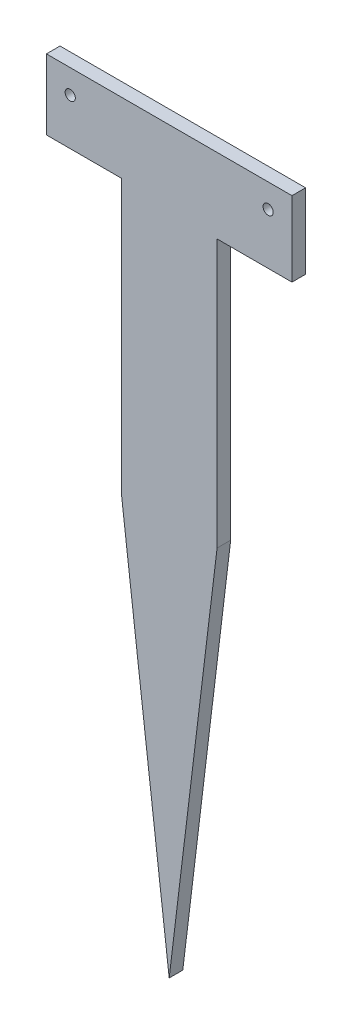
ISO-10303-21;
HEADER;
FILE_DESCRIPTION(('STEP AP214'),'2;1');
FILE_NAME('part.step','',(''),(''),'','','');
FILE_SCHEMA(('AUTOMOTIVE_DESIGN { 1 0 10303 214 1 1 1 1 }'));
ENDSEC;
DATA;
#1=APPLICATION_CONTEXT('core data for automotive mechanical design processes');
#2=APPLICATION_PROTOCOL_DEFINITION('international standard','automotive_design',2000,#1);
#3=PRODUCT_CONTEXT('',#1,'mechanical');
#4=PRODUCT('Part','Part','',(#3));
#5=PRODUCT_RELATED_PRODUCT_CATEGORY('part','',(#4));
#6=PRODUCT_DEFINITION_FORMATION('','',#4);
#7=PRODUCT_DEFINITION_CONTEXT('part definition',#1,'design');
#8=PRODUCT_DEFINITION('design','',#6,#7);
#9=PRODUCT_DEFINITION_SHAPE('','',#8);
#10=(LENGTH_UNIT() NAMED_UNIT(*) SI_UNIT(.MILLI.,.METRE.));
#11=(NAMED_UNIT(*) PLANE_ANGLE_UNIT() SI_UNIT($,.RADIAN.));
#12=(NAMED_UNIT(*) SI_UNIT($,.STERADIAN.) SOLID_ANGLE_UNIT());
#13=UNCERTAINTY_MEASURE_WITH_UNIT(LENGTH_MEASURE(1.E-05),#10,'distance_accuracy_value','');
#14=(GEOMETRIC_REPRESENTATION_CONTEXT(3) GLOBAL_UNCERTAINTY_ASSIGNED_CONTEXT((#13)) GLOBAL_UNIT_ASSIGNED_CONTEXT((#10,
#11,#12)) REPRESENTATION_CONTEXT('',''));
#15=CARTESIAN_POINT('',(0.,0.,0.));
#16=DIRECTION('',(0.,0.,1.));
#17=DIRECTION('',(1.,0.,0.));
#18=AXIS2_PLACEMENT_3D('',#15,#16,#17);
#19=CARTESIAN_POINT('',(0.,0.,4.));
#20=DIRECTION('',(0.,0.,-1.));
#21=DIRECTION('',(-1.,0.,0.));
#22=AXIS2_PLACEMENT_3D('',#19,#20,#21);
#23=PLANE('',#22);
#24=DIRECTION('',(0.,-1.,0.));
#25=VECTOR('',#24,1.);
#26=CARTESIAN_POINT('',(-7.,-13.6178388220856,4.));
#27=LINE('',#26,#25);
#28=CARTESIAN_POINT('',(-7.,7.,4.));
#29=VERTEX_POINT('',#28);
#30=CARTESIAN_POINT('',(-7.,-13.6178388220856,4.));
#31=VERTEX_POINT('',#30);
#32=EDGE_CURVE('E173',#29,#31,#27,.T.);
#33=ORIENTED_EDGE('',*,*,#32,.T.);
#34=DIRECTION('',(1.,0.,0.));
#35=VECTOR('',#34,1.);
#36=CARTESIAN_POINT('',(15.,-13.6178388220856,4.));
#37=LINE('',#36,#35);
#38=CARTESIAN_POINT('',(15.,-13.6178388220856,4.));
#39=VERTEX_POINT('',#38);
#40=EDGE_CURVE('E103',#31,#39,#37,.T.);
#41=ORIENTED_EDGE('',*,*,#40,.T.);
#42=DIRECTION('',(0.,-1.,0.));
#43=VECTOR('',#42,1.);
#44=CARTESIAN_POINT('',(15.,-93.6178388220856,4.));
#45=LINE('',#44,#43);
#46=CARTESIAN_POINT('',(15.,-93.6178388220856,4.));
#47=VERTEX_POINT('',#46);
#48=EDGE_CURVE('E198',#39,#47,#45,.T.);
#49=ORIENTED_EDGE('',*,*,#48,.T.);
#50=DIRECTION('',(0.119936836472726,-0.992781524433707,0.));
#51=VECTOR('',#50,1.);
#52=CARTESIAN_POINT('',(15.,-93.6178388220856,4.));
#53=LINE('',#52,#51);
#54=CARTESIAN_POINT('',(29.06,-210.,4.));
#55=VERTEX_POINT('',#54);
#56=EDGE_CURVE('E216',#47,#55,#53,.T.);
#57=ORIENTED_EDGE('',*,*,#56,.T.);
#58=DIRECTION('',(0.119936836472726,0.992781524433707,0.));
#59=VECTOR('',#58,1.);
#60=CARTESIAN_POINT('',(29.06,-210.,4.));
#61=LINE('',#60,#59);
#62=CARTESIAN_POINT('',(43.12,-93.6178388220856,4.));
#63=VERTEX_POINT('',#62);
#64=EDGE_CURVE('E214',#55,#63,#61,.T.);
#65=ORIENTED_EDGE('',*,*,#64,.T.);
#66=DIRECTION('',(0.,1.,0.));
#67=VECTOR('',#66,1.);
#68=CARTESIAN_POINT('',(43.12,-15.,4.));
#69=LINE('',#68,#67);
#70=CARTESIAN_POINT('',(43.12,-15.,4.));
#71=VERTEX_POINT('',#70);
#72=EDGE_CURVE('E125',#63,#71,#69,.T.);
#73=ORIENTED_EDGE('',*,*,#72,.T.);
#74=DIRECTION('',(1.,0.,0.));
#75=VECTOR('',#74,1.);
#76=CARTESIAN_POINT('',(65.12,-15.,4.));
#77=LINE('',#76,#75);
#78=CARTESIAN_POINT('',(65.12,-15.,4.));
#79=VERTEX_POINT('',#78);
#80=EDGE_CURVE('E119',#71,#79,#77,.T.);
#81=ORIENTED_EDGE('',*,*,#80,.T.);
#82=DIRECTION('',(0.,1.,0.));
#83=VECTOR('',#82,1.);
#84=CARTESIAN_POINT('',(65.12,7.,4.));
#85=LINE('',#84,#83);
#86=CARTESIAN_POINT('',(65.12,7.,4.));
#87=VERTEX_POINT('',#86);
#88=EDGE_CURVE('E123',#79,#87,#85,.T.);
#89=ORIENTED_EDGE('',*,*,#88,.T.);
#90=DIRECTION('',(-1.,0.,0.));
#91=VECTOR('',#90,1.);
#92=CARTESIAN_POINT('',(-7.,7.,4.));
#93=LINE('',#92,#91);
#94=EDGE_CURVE('E57',#87,#29,#93,.T.);
#95=ORIENTED_EDGE('',*,*,#94,.T.);
#96=EDGE_LOOP('',(#33,#41,#49,#57,#65,#73,#81,#89,#95));
#97=FACE_BOUND('',#96,.T.);
#98=CARTESIAN_POINT('',(0.,0.,4.));
#99=DIRECTION('',(0.,0.,1.));
#100=DIRECTION('',(1.,0.,0.));
#101=AXIS2_PLACEMENT_3D('',#98,#99,#100);
#102=CIRCLE('',#101,1.5);
#103=CARTESIAN_POINT('',(1.5,0.,4.));
#104=VERTEX_POINT('',#103);
#105=EDGE_CURVE('E152',#104,#104,#102,.T.);
#106=ORIENTED_EDGE('',*,*,#105,.F.);
#107=EDGE_LOOP('',(#106));
#108=FACE_BOUND('',#107,.T.);
#109=CARTESIAN_POINT('',(58.12,0.,4.));
#110=DIRECTION('',(0.,0.,1.));
#111=DIRECTION('',(1.,0.,0.));
#112=AXIS2_PLACEMENT_3D('',#109,#110,#111);
#113=CIRCLE('',#112,1.5);
#114=CARTESIAN_POINT('',(59.62,0.,4.));
#115=VERTEX_POINT('',#114);
#116=EDGE_CURVE('E232',#115,#115,#113,.T.);
#117=ORIENTED_EDGE('',*,*,#116,.F.);
#118=EDGE_LOOP('',(#117));
#119=FACE_BOUND('',#118,.T.);
#120=ADVANCED_FACE('F39',(#97,#108,#119),#23,.F.);
#121=CARTESIAN_POINT('',(0.,0.,0.));
#122=DIRECTION('',(0.,0.,-1.));
#123=DIRECTION('',(-1.,0.,0.));
#124=AXIS2_PLACEMENT_3D('',#121,#122,#123);
#125=PLANE('',#124);
#126=CARTESIAN_POINT('',(0.,0.,0.));
#127=DIRECTION('',(0.,0.,1.));
#128=DIRECTION('',(1.,0.,0.));
#129=AXIS2_PLACEMENT_3D('',#126,#127,#128);
#130=CIRCLE('',#129,1.5);
#131=CARTESIAN_POINT('',(1.5,0.,0.));
#132=VERTEX_POINT('',#131);
#133=EDGE_CURVE('E228',#132,#132,#130,.T.);
#134=ORIENTED_EDGE('',*,*,#133,.T.);
#135=EDGE_LOOP('',(#134));
#136=FACE_BOUND('',#135,.T.);
#137=DIRECTION('',(0.,-1.,0.));
#138=VECTOR('',#137,1.);
#139=CARTESIAN_POINT('',(-7.,-13.6178388220856,0.));
#140=LINE('',#139,#138);
#141=CARTESIAN_POINT('',(-7.,7.,0.));
#142=VERTEX_POINT('',#141);
#143=CARTESIAN_POINT('',(-7.,-13.6178388220856,0.));
#144=VERTEX_POINT('',#143);
#145=EDGE_CURVE('E147',#142,#144,#140,.T.);
#146=ORIENTED_EDGE('',*,*,#145,.F.);
#147=DIRECTION('',(-1.,0.,0.));
#148=VECTOR('',#147,1.);
#149=CARTESIAN_POINT('',(-7.,7.,0.));
#150=LINE('',#149,#148);
#151=CARTESIAN_POINT('',(65.12,7.,0.));
#152=VERTEX_POINT('',#151);
#153=EDGE_CURVE('E95',#152,#142,#150,.T.);
#154=ORIENTED_EDGE('',*,*,#153,.F.);
#155=DIRECTION('',(0.,1.,0.));
#156=VECTOR('',#155,1.);
#157=CARTESIAN_POINT('',(65.12,7.,0.));
#158=LINE('',#157,#156);
#159=CARTESIAN_POINT('',(65.12,-15.,0.));
#160=VERTEX_POINT('',#159);
#161=EDGE_CURVE('E89',#160,#152,#158,.T.);
#162=ORIENTED_EDGE('',*,*,#161,.F.);
#163=DIRECTION('',(1.,0.,0.));
#164=VECTOR('',#163,1.);
#165=CARTESIAN_POINT('',(65.12,-15.,0.));
#166=LINE('',#165,#164);
#167=CARTESIAN_POINT('',(43.12,-15.,0.));
#168=VERTEX_POINT('',#167);
#169=EDGE_CURVE('E134',#168,#160,#166,.T.);
#170=ORIENTED_EDGE('',*,*,#169,.F.);
#171=DIRECTION('',(0.,1.,0.));
#172=VECTOR('',#171,1.);
#173=CARTESIAN_POINT('',(43.12,-15.,0.));
#174=LINE('',#173,#172);
#175=CARTESIAN_POINT('',(43.12,-93.6178388220856,0.));
#176=VERTEX_POINT('',#175);
#177=EDGE_CURVE('E164',#176,#168,#174,.T.);
#178=ORIENTED_EDGE('',*,*,#177,.F.);
#179=DIRECTION('',(0.119936836472726,0.992781524433707,0.));
#180=VECTOR('',#179,1.);
#181=CARTESIAN_POINT('',(29.06,-210.,0.));
#182=LINE('',#181,#180);
#183=CARTESIAN_POINT('',(29.06,-210.,0.));
#184=VERTEX_POINT('',#183);
#185=EDGE_CURVE('E161',#184,#176,#182,.T.);
#186=ORIENTED_EDGE('',*,*,#185,.F.);
#187=DIRECTION('',(0.119936836472726,-0.992781524433707,0.));
#188=VECTOR('',#187,1.);
#189=CARTESIAN_POINT('',(15.,-93.6178388220856,0.));
#190=LINE('',#189,#188);
#191=CARTESIAN_POINT('',(15.,-93.6178388220856,0.));
#192=VERTEX_POINT('',#191);
#193=EDGE_CURVE('E158',#192,#184,#190,.T.);
#194=ORIENTED_EDGE('',*,*,#193,.F.);
#195=DIRECTION('',(0.,-1.,0.));
#196=VECTOR('',#195,1.);
#197=CARTESIAN_POINT('',(15.,-93.6178388220856,0.));
#198=LINE('',#197,#196);
#199=CARTESIAN_POINT('',(15.,-13.6178388220856,0.));
#200=VERTEX_POINT('',#199);
#201=EDGE_CURVE('E155',#200,#192,#198,.T.);
#202=ORIENTED_EDGE('',*,*,#201,.F.);
#203=DIRECTION('',(1.,0.,0.));
#204=VECTOR('',#203,1.);
#205=CARTESIAN_POINT('',(15.,-13.6178388220856,0.));
#206=LINE('',#205,#204);
#207=EDGE_CURVE('E151',#144,#200,#206,.T.);
#208=ORIENTED_EDGE('',*,*,#207,.F.);
#209=EDGE_LOOP('',(#146,#154,#162,#170,#178,#186,#194,#202,#208));
#210=FACE_BOUND('',#209,.T.);
#211=CARTESIAN_POINT('',(58.12,0.,0.));
#212=DIRECTION('',(0.,0.,1.));
#213=DIRECTION('',(1.,0.,0.));
#214=AXIS2_PLACEMENT_3D('',#211,#212,#213);
#215=CIRCLE('',#214,1.5);
#216=CARTESIAN_POINT('',(59.62,0.,0.));
#217=VERTEX_POINT('',#216);
#218=EDGE_CURVE('E236',#217,#217,#215,.T.);
#219=ORIENTED_EDGE('',*,*,#218,.T.);
#220=EDGE_LOOP('',(#219));
#221=FACE_BOUND('',#220,.T.);
#222=ADVANCED_FACE('F202',(#136,#210,#221),#125,.T.);
#223=CARTESIAN_POINT('',(-7.,-13.6178388220856,4.));
#224=DIRECTION('',(1.,0.,0.));
#225=DIRECTION('',(0.,0.,-1.));
#226=AXIS2_PLACEMENT_3D('',#223,#224,#225);
#227=PLANE('',#226);
#228=ORIENTED_EDGE('',*,*,#145,.T.);
#229=DIRECTION('',(0.,0.,-1.));
#230=VECTOR('',#229,1.);
#231=CARTESIAN_POINT('',(-7.,-13.6178388220856,4.));
#232=LINE('',#231,#230);
#233=EDGE_CURVE('E11',#31,#144,#232,.T.);
#234=ORIENTED_EDGE('',*,*,#233,.F.);
#235=ORIENTED_EDGE('',*,*,#32,.F.);
#236=DIRECTION('',(0.,0.,-1.));
#237=VECTOR('',#236,1.);
#238=CARTESIAN_POINT('',(-7.,7.,4.));
#239=LINE('',#238,#237);
#240=EDGE_CURVE('E143',#29,#142,#239,.T.);
#241=ORIENTED_EDGE('',*,*,#240,.T.);
#242=EDGE_LOOP('',(#228,#234,#235,#241));
#243=FACE_BOUND('',#242,.T.);
#244=ADVANCED_FACE('F41',(#243),#227,.F.);
#245=CARTESIAN_POINT('',(15.,-13.6178388220856,4.));
#246=DIRECTION('',(0.,1.,0.));
#247=DIRECTION('',(-1.,0.,0.));
#248=AXIS2_PLACEMENT_3D('',#245,#246,#247);
#249=PLANE('',#248);
#250=ORIENTED_EDGE('',*,*,#207,.T.);
#251=DIRECTION('',(0.,0.,-1.));
#252=VECTOR('',#251,1.);
#253=CARTESIAN_POINT('',(15.,-13.6178388220856,4.));
#254=LINE('',#253,#252);
#255=EDGE_CURVE('E49',#39,#200,#254,.T.);
#256=ORIENTED_EDGE('',*,*,#255,.F.);
#257=ORIENTED_EDGE('',*,*,#40,.F.);
#258=ORIENTED_EDGE('',*,*,#233,.T.);
#259=EDGE_LOOP('',(#250,#256,#257,#258));
#260=FACE_BOUND('',#259,.T.);
#261=ADVANCED_FACE('F274',(#260),#249,.F.);
#262=CARTESIAN_POINT('',(15.,-93.6178388220856,4.));
#263=DIRECTION('',(1.,0.,0.));
#264=DIRECTION('',(0.,0.,-1.));
#265=AXIS2_PLACEMENT_3D('',#262,#263,#264);
#266=PLANE('',#265);
#267=ORIENTED_EDGE('',*,*,#201,.T.);
#268=DIRECTION('',(0.,0.,-1.));
#269=VECTOR('',#268,1.);
#270=CARTESIAN_POINT('',(15.,-93.6178388220856,4.));
#271=LINE('',#270,#269);
#272=EDGE_CURVE('E188',#47,#192,#271,.T.);
#273=ORIENTED_EDGE('',*,*,#272,.F.);
#274=ORIENTED_EDGE('',*,*,#48,.F.);
#275=ORIENTED_EDGE('',*,*,#255,.T.);
#276=EDGE_LOOP('',(#267,#273,#274,#275));
#277=FACE_BOUND('',#276,.T.);
#278=ADVANCED_FACE('F196',(#277),#266,.F.);
#279=CARTESIAN_POINT('',(15.,-93.6178388220856,4.));
#280=DIRECTION('',(0.992781524433707,0.119936836472726,0.));
#281=DIRECTION('',(-0.119936836472726,0.992781524433707,0.));
#282=AXIS2_PLACEMENT_3D('',#279,#280,#281);
#283=PLANE('',#282);
#284=ORIENTED_EDGE('',*,*,#193,.T.);
#285=DIRECTION('',(0.,0.,-1.));
#286=VECTOR('',#285,1.);
#287=CARTESIAN_POINT('',(29.06,-210.,4.));
#288=LINE('',#287,#286);
#289=EDGE_CURVE('E184',#55,#184,#288,.T.);
#290=ORIENTED_EDGE('',*,*,#289,.F.);
#291=ORIENTED_EDGE('',*,*,#56,.F.);
#292=ORIENTED_EDGE('',*,*,#272,.T.);
#293=EDGE_LOOP('',(#284,#290,#291,#292));
#294=FACE_BOUND('',#293,.T.);
#295=ADVANCED_FACE('F208',(#294),#283,.F.);
#296=CARTESIAN_POINT('',(29.06,-210.,4.));
#297=DIRECTION('',(-0.992781524433707,0.119936836472726,0.));
#298=DIRECTION('',(-0.119936836472726,-0.992781524433707,0.));
#299=AXIS2_PLACEMENT_3D('',#296,#297,#298);
#300=PLANE('',#299);
#301=ORIENTED_EDGE('',*,*,#185,.T.);
#302=DIRECTION('',(0.,0.,-1.));
#303=VECTOR('',#302,1.);
#304=CARTESIAN_POINT('',(43.12,-93.6178388220856,4.));
#305=LINE('',#304,#303);
#306=EDGE_CURVE('E180',#63,#176,#305,.T.);
#307=ORIENTED_EDGE('',*,*,#306,.F.);
#308=ORIENTED_EDGE('',*,*,#64,.F.);
#309=ORIENTED_EDGE('',*,*,#289,.T.);
#310=EDGE_LOOP('',(#301,#307,#308,#309));
#311=FACE_BOUND('',#310,.T.);
#312=ADVANCED_FACE('F212',(#311),#300,.F.);
#313=CARTESIAN_POINT('',(43.12,-15.,4.));
#314=DIRECTION('',(-1.,0.,0.));
#315=DIRECTION('',(0.,-1.,0.));
#316=AXIS2_PLACEMENT_3D('',#313,#314,#315);
#317=PLANE('',#316);
#318=ORIENTED_EDGE('',*,*,#177,.T.);
#319=DIRECTION('',(0.,0.,-1.));
#320=VECTOR('',#319,1.);
#321=CARTESIAN_POINT('',(43.12,-15.,4.));
#322=LINE('',#321,#320);
#323=EDGE_CURVE('E136',#71,#168,#322,.T.);
#324=ORIENTED_EDGE('',*,*,#323,.F.);
#325=ORIENTED_EDGE('',*,*,#72,.F.);
#326=ORIENTED_EDGE('',*,*,#306,.T.);
#327=EDGE_LOOP('',(#318,#324,#325,#326));
#328=FACE_BOUND('',#327,.T.);
#329=ADVANCED_FACE('F265',(#328),#317,.F.);
#330=CARTESIAN_POINT('',(65.12,-15.,4.));
#331=DIRECTION('',(0.,1.,0.));
#332=DIRECTION('',(-1.,0.,0.));
#333=AXIS2_PLACEMENT_3D('',#330,#331,#332);
#334=PLANE('',#333);
#335=ORIENTED_EDGE('',*,*,#169,.T.);
#336=DIRECTION('',(0.,0.,-1.));
#337=VECTOR('',#336,1.);
#338=CARTESIAN_POINT('',(65.12,-15.,4.));
#339=LINE('',#338,#337);
#340=EDGE_CURVE('E131',#79,#160,#339,.T.);
#341=ORIENTED_EDGE('',*,*,#340,.F.);
#342=ORIENTED_EDGE('',*,*,#80,.F.);
#343=ORIENTED_EDGE('',*,*,#323,.T.);
#344=EDGE_LOOP('',(#335,#341,#342,#343));
#345=FACE_BOUND('',#344,.T.);
#346=ADVANCED_FACE('F132',(#345),#334,.F.);
#347=CARTESIAN_POINT('',(65.12,7.,4.));
#348=DIRECTION('',(-1.,0.,0.));
#349=DIRECTION('',(0.,0.,1.));
#350=AXIS2_PLACEMENT_3D('',#347,#348,#349);
#351=PLANE('',#350);
#352=ORIENTED_EDGE('',*,*,#161,.T.);
#353=DIRECTION('',(0.,0.,-1.));
#354=VECTOR('',#353,1.);
#355=CARTESIAN_POINT('',(65.12,7.,4.));
#356=LINE('',#355,#354);
#357=EDGE_CURVE('E137',#87,#152,#356,.T.);
#358=ORIENTED_EDGE('',*,*,#357,.F.);
#359=ORIENTED_EDGE('',*,*,#88,.F.);
#360=ORIENTED_EDGE('',*,*,#340,.T.);
#361=EDGE_LOOP('',(#352,#358,#359,#360));
#362=FACE_BOUND('',#361,.T.);
#363=ADVANCED_FACE('F139',(#362),#351,.F.);
#364=CARTESIAN_POINT('',(-7.,7.,4.));
#365=DIRECTION('',(0.,-1.,0.));
#366=DIRECTION('',(0.,0.,-1.));
#367=AXIS2_PLACEMENT_3D('',#364,#365,#366);
#368=PLANE('',#367);
#369=ORIENTED_EDGE('',*,*,#153,.T.);
#370=ORIENTED_EDGE('',*,*,#240,.F.);
#371=ORIENTED_EDGE('',*,*,#94,.F.);
#372=ORIENTED_EDGE('',*,*,#357,.T.);
#373=EDGE_LOOP('',(#369,#370,#371,#372));
#374=FACE_BOUND('',#373,.T.);
#375=ADVANCED_FACE('F258',(#374),#368,.F.);
#376=CARTESIAN_POINT('',(0.,0.,4.));
#377=DIRECTION('',(0.,0.,-1.));
#378=DIRECTION('',(-1.,0.,0.));
#379=AXIS2_PLACEMENT_3D('',#376,#377,#378);
#380=CYLINDRICAL_SURFACE('',#379,1.5);
#381=ORIENTED_EDGE('',*,*,#105,.T.);
#382=EDGE_LOOP('',(#381));
#383=FACE_BOUND('',#382,.T.);
#384=ORIENTED_EDGE('',*,*,#133,.F.);
#385=EDGE_LOOP('',(#384));
#386=FACE_BOUND('',#385,.T.);
#387=ADVANCED_FACE('F255',(#383,#386),#380,.F.);
#388=CARTESIAN_POINT('',(58.12,0.,4.));
#389=DIRECTION('',(0.,0.,-1.));
#390=DIRECTION('',(-1.,0.,0.));
#391=AXIS2_PLACEMENT_3D('',#388,#389,#390);
#392=CYLINDRICAL_SURFACE('',#391,1.5);
#393=ORIENTED_EDGE('',*,*,#116,.T.);
#394=EDGE_LOOP('',(#393));
#395=FACE_BOUND('',#394,.T.);
#396=ORIENTED_EDGE('',*,*,#218,.F.);
#397=EDGE_LOOP('',(#396));
#398=FACE_BOUND('',#397,.T.);
#399=ADVANCED_FACE('F244',(#395,#398),#392,.F.);
#400=CLOSED_SHELL('',(#120,#222,#244,#261,#278,#295,#312,#329,#346,#363,#375,#387,#399));
#401=MANIFOLD_SOLID_BREP('B2',#400);
#402=ADVANCED_BREP_SHAPE_REPRESENTATION('',(#18,#401),#14);
#403=SHAPE_DEFINITION_REPRESENTATION(#9,#402);
ENDSEC;
END-ISO-10303-21;
